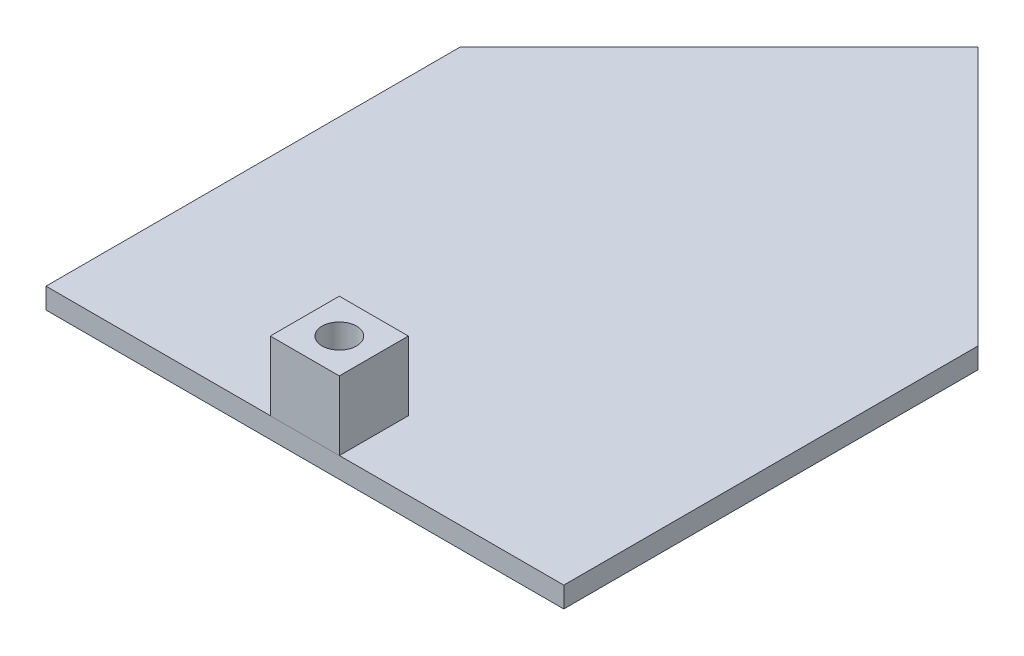
ISO-10303-21;
HEADER;
FILE_DESCRIPTION(('STEP AP214'),'2;1');
FILE_NAME('part.step','',(''),(''),'','','');
FILE_SCHEMA(('AUTOMOTIVE_DESIGN { 1 0 10303 214 1 1 1 1 }'));
ENDSEC;
DATA;
#1=APPLICATION_CONTEXT('core data for automotive mechanical design processes');
#2=APPLICATION_PROTOCOL_DEFINITION('international standard','automotive_design',2000,#1);
#3=PRODUCT_CONTEXT('',#1,'mechanical');
#4=PRODUCT('Part','Part','',(#3));
#5=PRODUCT_RELATED_PRODUCT_CATEGORY('part','',(#4));
#6=PRODUCT_DEFINITION_FORMATION('','',#4);
#7=PRODUCT_DEFINITION_CONTEXT('part definition',#1,'design');
#8=PRODUCT_DEFINITION('design','',#6,#7);
#9=PRODUCT_DEFINITION_SHAPE('','',#8);
#10=(LENGTH_UNIT() NAMED_UNIT(*) SI_UNIT(.MILLI.,.METRE.));
#11=(NAMED_UNIT(*) PLANE_ANGLE_UNIT() SI_UNIT($,.RADIAN.));
#12=(NAMED_UNIT(*) SI_UNIT($,.STERADIAN.) SOLID_ANGLE_UNIT());
#13=UNCERTAINTY_MEASURE_WITH_UNIT(LENGTH_MEASURE(1.E-05),#10,'distance_accuracy_value','');
#14=(GEOMETRIC_REPRESENTATION_CONTEXT(3) GLOBAL_UNCERTAINTY_ASSIGNED_CONTEXT((#13)) GLOBAL_UNIT_ASSIGNED_CONTEXT((#10,
#11,#12)) REPRESENTATION_CONTEXT('',''));
#15=CARTESIAN_POINT('',(0.,0.,0.));
#16=DIRECTION('',(0.,0.,1.));
#17=DIRECTION('',(1.,0.,0.));
#18=AXIS2_PLACEMENT_3D('',#15,#16,#17);
#19=CARTESIAN_POINT('',(-34.0392770239018,6.,-85.8256464799716));
#20=DIRECTION('',(1.,0.,0.));
#21=DIRECTION('',(0.,0.,-1.));
#22=AXIS2_PLACEMENT_3D('',#19,#20,#21);
#23=PLANE('',#22);
#24=DIRECTION('',(0.,0.,1.));
#25=VECTOR('',#24,1.);
#26=CARTESIAN_POINT('',(-34.0392770239018,0.,-85.8256464799716));
#27=LINE('',#26,#25);
#28=CARTESIAN_POINT('',(-34.0392770239018,0.,-85.8256464799716));
#29=VERTEX_POINT('',#28);
#30=CARTESIAN_POINT('',(-34.0392770239018,0.,34.1743535200284));
#31=VERTEX_POINT('',#30);
#32=EDGE_CURVE('E133',#29,#31,#27,.T.);
#33=ORIENTED_EDGE('',*,*,#32,.T.);
#34=DIRECTION('',(0.,-1.,0.));
#35=VECTOR('',#34,1.);
#36=CARTESIAN_POINT('',(-34.0392770239018,6.,34.1743535200284));
#37=LINE('',#36,#35);
#38=CARTESIAN_POINT('',(-34.0392770239018,6.,34.1743535200284));
#39=VERTEX_POINT('',#38);
#40=EDGE_CURVE('E38',#39,#31,#37,.T.);
#41=ORIENTED_EDGE('',*,*,#40,.F.);
#42=DIRECTION('',(0.,0.,1.));
#43=VECTOR('',#42,1.);
#44=CARTESIAN_POINT('',(-34.0392770239018,6.,-85.8256464799716));
#45=LINE('',#44,#43);
#46=CARTESIAN_POINT('',(-34.0392770239018,6.,-85.8256464799716));
#47=VERTEX_POINT('',#46);
#48=EDGE_CURVE('E142',#47,#39,#45,.T.);
#49=ORIENTED_EDGE('',*,*,#48,.F.);
#50=DIRECTION('',(0.,-1.,0.));
#51=VECTOR('',#50,1.);
#52=CARTESIAN_POINT('',(-34.0392770239018,6.,-85.8256464799716));
#53=LINE('',#52,#51);
#54=EDGE_CURVE('E156',#47,#29,#53,.T.);
#55=ORIENTED_EDGE('',*,*,#54,.T.);
#56=EDGE_LOOP('',(#33,#41,#49,#55));
#57=FACE_BOUND('',#56,.T.);
#58=ADVANCED_FACE('F35',(#57),#23,.F.);
#59=CARTESIAN_POINT('',(-34.0392770239018,6.,34.1743535200284));
#60=DIRECTION('',(0.,0.,-1.));
#61=DIRECTION('',(-1.,0.,0.));
#62=AXIS2_PLACEMENT_3D('',#59,#60,#61);
#63=PLANE('',#62);
#64=DIRECTION('',(1.,0.,0.));
#65=VECTOR('',#64,1.);
#66=CARTESIAN_POINT('',(-34.0392770239018,0.,34.1743535200284));
#67=LINE('',#66,#65);
#68=CARTESIAN_POINT('',(115.960722976098,0.,34.1743535200284));
#69=VERTEX_POINT('',#68);
#70=EDGE_CURVE('E136',#31,#69,#67,.T.);
#71=ORIENTED_EDGE('',*,*,#70,.T.);
#72=DIRECTION('',(0.,-1.,0.));
#73=VECTOR('',#72,1.);
#74=CARTESIAN_POINT('',(115.960722976098,6.,34.1743535200284));
#75=LINE('',#74,#73);
#76=CARTESIAN_POINT('',(115.960722976098,6.,34.1743535200284));
#77=VERTEX_POINT('',#76);
#78=EDGE_CURVE('E171',#77,#69,#75,.T.);
#79=ORIENTED_EDGE('',*,*,#78,.F.);
#80=DIRECTION('',(1.,0.,0.));
#81=VECTOR('',#80,1.);
#82=CARTESIAN_POINT('',(-34.0392770239018,6.,34.1743535200284));
#83=LINE('',#82,#81);
#84=CARTESIAN_POINT('',(50.9607229760982,6.,34.1743535200284));
#85=VERTEX_POINT('',#84);
#86=EDGE_CURVE('E145',#85,#77,#83,.T.);
#87=ORIENTED_EDGE('',*,*,#86,.F.);
#88=CARTESIAN_POINT('',(30.9607229760982,6.,34.1743535200284));
#89=VERTEX_POINT('',#88);
#90=EDGE_CURVE('E151',#89,#85,#83,.T.);
#91=ORIENTED_EDGE('',*,*,#90,.F.);
#92=EDGE_CURVE('E147',#39,#89,#83,.T.);
#93=ORIENTED_EDGE('',*,*,#92,.F.);
#94=ORIENTED_EDGE('',*,*,#40,.T.);
#95=EDGE_LOOP('',(#71,#79,#87,#91,#93,#94));
#96=FACE_BOUND('',#95,.T.);
#97=ADVANCED_FACE('F180',(#96),#63,.F.);
#98=CARTESIAN_POINT('',(115.960722976098,6.,34.1743535200284));
#99=DIRECTION('',(-1.,0.,0.));
#100=DIRECTION('',(0.,0.,1.));
#101=AXIS2_PLACEMENT_3D('',#98,#99,#100);
#102=PLANE('',#101);
#103=DIRECTION('',(0.,0.,-1.));
#104=VECTOR('',#103,1.);
#105=CARTESIAN_POINT('',(115.960722976098,0.,34.1743535200284));
#106=LINE('',#105,#104);
#107=CARTESIAN_POINT('',(115.960722976098,0.,-85.8256464799721));
#108=VERTEX_POINT('',#107);
#109=EDGE_CURVE('E159',#69,#108,#106,.T.);
#110=ORIENTED_EDGE('',*,*,#109,.T.);
#111=DIRECTION('',(0.,-1.,0.));
#112=VECTOR('',#111,1.);
#113=CARTESIAN_POINT('',(115.960722976098,6.,-85.8256464799721));
#114=LINE('',#113,#112);
#115=CARTESIAN_POINT('',(115.960722976098,6.,-85.8256464799721));
#116=VERTEX_POINT('',#115);
#117=EDGE_CURVE('E169',#116,#108,#114,.T.);
#118=ORIENTED_EDGE('',*,*,#117,.F.);
#119=DIRECTION('',(0.,0.,-1.));
#120=VECTOR('',#119,1.);
#121=CARTESIAN_POINT('',(115.960722976098,6.,34.1743535200284));
#122=LINE('',#121,#120);
#123=EDGE_CURVE('E150',#77,#116,#122,.T.);
#124=ORIENTED_EDGE('',*,*,#123,.F.);
#125=ORIENTED_EDGE('',*,*,#78,.T.);
#126=EDGE_LOOP('',(#110,#118,#124,#125));
#127=FACE_BOUND('',#126,.T.);
#128=ADVANCED_FACE('F190',(#127),#102,.F.);
#129=CARTESIAN_POINT('',(115.960722976098,6.,-85.8256464799721));
#130=DIRECTION('',(-0.707106781186546,0.,0.707106781186549));
#131=DIRECTION('',(0.707106781186549,0.,0.707106781186546));
#132=AXIS2_PLACEMENT_3D('',#129,#130,#131);
#133=PLANE('',#132);
#134=DIRECTION('',(-0.707106781186549,0.,-0.707106781186546));
#135=VECTOR('',#134,1.);
#136=CARTESIAN_POINT('',(115.960722976098,0.,-85.8256464799721));
#137=LINE('',#136,#135);
#138=CARTESIAN_POINT('',(40.9607229760982,0.,-160.825646479972));
#139=VERTEX_POINT('',#138);
#140=EDGE_CURVE('E161',#108,#139,#137,.T.);
#141=ORIENTED_EDGE('',*,*,#140,.T.);
#142=DIRECTION('',(0.,-1.,0.));
#143=VECTOR('',#142,1.);
#144=CARTESIAN_POINT('',(40.9607229760982,6.,-160.825646479972));
#145=LINE('',#144,#143);
#146=CARTESIAN_POINT('',(40.9607229760982,6.,-160.825646479972));
#147=VERTEX_POINT('',#146);
#148=EDGE_CURVE('E166',#147,#139,#145,.T.);
#149=ORIENTED_EDGE('',*,*,#148,.F.);
#150=DIRECTION('',(-0.707106781186549,0.,-0.707106781186546));
#151=VECTOR('',#150,1.);
#152=CARTESIAN_POINT('',(115.960722976098,6.,-85.8256464799721));
#153=LINE('',#152,#151);
#154=EDGE_CURVE('E153',#116,#147,#153,.T.);
#155=ORIENTED_EDGE('',*,*,#154,.F.);
#156=ORIENTED_EDGE('',*,*,#117,.T.);
#157=EDGE_LOOP('',(#141,#149,#155,#156));
#158=FACE_BOUND('',#157,.T.);
#159=ADVANCED_FACE('F193',(#158),#133,.F.);
#160=CARTESIAN_POINT('',(40.9607229760982,6.,-160.825646479972));
#161=DIRECTION('',(0.707106781186549,0.,0.707106781186546));
#162=DIRECTION('',(0.707106781186546,0.,-0.707106781186549));
#163=AXIS2_PLACEMENT_3D('',#160,#161,#162);
#164=PLANE('',#163);
#165=DIRECTION('',(-0.707106781186546,0.,0.707106781186549));
#166=VECTOR('',#165,1.);
#167=CARTESIAN_POINT('',(40.9607229760982,0.,-160.825646479972));
#168=LINE('',#167,#166);
#169=EDGE_CURVE('E146',#139,#29,#168,.T.);
#170=ORIENTED_EDGE('',*,*,#169,.T.);
#171=ORIENTED_EDGE('',*,*,#54,.F.);
#172=DIRECTION('',(-0.707106781186546,0.,0.707106781186549));
#173=VECTOR('',#172,1.);
#174=CARTESIAN_POINT('',(40.9607229760982,6.,-160.825646479972));
#175=LINE('',#174,#173);
#176=EDGE_CURVE('E155',#147,#47,#175,.T.);
#177=ORIENTED_EDGE('',*,*,#176,.F.);
#178=ORIENTED_EDGE('',*,*,#148,.T.);
#179=EDGE_LOOP('',(#170,#171,#177,#178));
#180=FACE_BOUND('',#179,.T.);
#181=ADVANCED_FACE('F251',(#180),#164,.F.);
#182=CARTESIAN_POINT('',(0.,6.,0.));
#183=DIRECTION('',(0.,1.,0.));
#184=DIRECTION('',(0.,0.,1.));
#185=AXIS2_PLACEMENT_3D('',#182,#183,#184);
#186=PLANE('',#185);
#187=DIRECTION('',(0.,0.,-1.));
#188=VECTOR('',#187,1.);
#189=CARTESIAN_POINT('',(50.9607229760982,6.,14.2063659947711));
#190=LINE('',#189,#188);
#191=CARTESIAN_POINT('',(50.9607229760982,6.,14.2063659947711));
#192=VERTEX_POINT('',#191);
#193=EDGE_CURVE('E11',#85,#192,#190,.T.);
#194=ORIENTED_EDGE('',*,*,#193,.F.);
#195=ORIENTED_EDGE('',*,*,#86,.T.);
#196=ORIENTED_EDGE('',*,*,#123,.T.);
#197=ORIENTED_EDGE('',*,*,#154,.T.);
#198=ORIENTED_EDGE('',*,*,#176,.T.);
#199=ORIENTED_EDGE('',*,*,#48,.T.);
#200=ORIENTED_EDGE('',*,*,#92,.T.);
#201=DIRECTION('',(0.,0.,1.));
#202=VECTOR('',#201,1.);
#203=CARTESIAN_POINT('',(30.9607229760982,6.,14.2063659947711));
#204=LINE('',#203,#202);
#205=CARTESIAN_POINT('',(30.9607229760982,6.,14.2063659947711));
#206=VERTEX_POINT('',#205);
#207=EDGE_CURVE('E214',#206,#89,#204,.T.);
#208=ORIENTED_EDGE('',*,*,#207,.F.);
#209=DIRECTION('',(-1.,0.,0.));
#210=VECTOR('',#209,1.);
#211=CARTESIAN_POINT('',(30.9607229760982,6.,14.2063659947711));
#212=LINE('',#211,#210);
#213=EDGE_CURVE('E51',#192,#206,#212,.T.);
#214=ORIENTED_EDGE('',*,*,#213,.F.);
#215=EDGE_LOOP('',(#194,#195,#196,#197,#198,#199,#200,#208,#214));
#216=FACE_BOUND('',#215,.T.);
#217=ADVANCED_FACE('F196',(#216),#186,.T.);
#218=CARTESIAN_POINT('',(0.,0.,0.));
#219=DIRECTION('',(0.,1.,0.));
#220=DIRECTION('',(0.,0.,1.));
#221=AXIS2_PLACEMENT_3D('',#218,#219,#220);
#222=PLANE('',#221);
#223=ORIENTED_EDGE('',*,*,#32,.F.);
#224=ORIENTED_EDGE('',*,*,#169,.F.);
#225=ORIENTED_EDGE('',*,*,#140,.F.);
#226=ORIENTED_EDGE('',*,*,#109,.F.);
#227=ORIENTED_EDGE('',*,*,#70,.F.);
#228=EDGE_LOOP('',(#223,#224,#225,#226,#227));
#229=FACE_BOUND('',#228,.T.);
#230=ADVANCED_FACE('F187',(#229),#222,.F.);
#231=CARTESIAN_POINT('',(0.,26.,0.));
#232=DIRECTION('',(0.,-1.,0.));
#233=DIRECTION('',(0.,0.,-1.));
#234=AXIS2_PLACEMENT_3D('',#231,#232,#233);
#235=PLANE('',#234);
#236=DIRECTION('',(0.,0.,-1.));
#237=VECTOR('',#236,1.);
#238=CARTESIAN_POINT('',(50.9607229760982,26.,14.2063659947711));
#239=LINE('',#238,#237);
#240=CARTESIAN_POINT('',(50.9607229760982,26.,34.2063659947711));
#241=VERTEX_POINT('',#240);
#242=CARTESIAN_POINT('',(50.9607229760982,26.,14.2063659947711));
#243=VERTEX_POINT('',#242);
#244=EDGE_CURVE('E119',#241,#243,#239,.T.);
#245=ORIENTED_EDGE('',*,*,#244,.T.);
#246=DIRECTION('',(-1.,0.,0.));
#247=VECTOR('',#246,1.);
#248=CARTESIAN_POINT('',(30.9607229760982,26.,14.2063659947711));
#249=LINE('',#248,#247);
#250=CARTESIAN_POINT('',(30.9607229760982,26.,14.2063659947711));
#251=VERTEX_POINT('',#250);
#252=EDGE_CURVE('E109',#243,#251,#249,.T.);
#253=ORIENTED_EDGE('',*,*,#252,.T.);
#254=DIRECTION('',(0.,0.,1.));
#255=VECTOR('',#254,1.);
#256=CARTESIAN_POINT('',(30.9607229760982,26.,14.2063659947711));
#257=LINE('',#256,#255);
#258=CARTESIAN_POINT('',(30.9607229760982,26.,34.2063659947711));
#259=VERTEX_POINT('',#258);
#260=EDGE_CURVE('E118',#251,#259,#257,.T.);
#261=ORIENTED_EDGE('',*,*,#260,.T.);
#262=DIRECTION('',(1.,0.,0.));
#263=VECTOR('',#262,1.);
#264=CARTESIAN_POINT('',(50.9607229760982,26.,34.2063659947711));
#265=LINE('',#264,#263);
#266=EDGE_CURVE('E125',#259,#241,#265,.T.);
#267=ORIENTED_EDGE('',*,*,#266,.T.);
#268=EDGE_LOOP('',(#245,#253,#261,#267));
#269=FACE_BOUND('',#268,.T.);
#270=CARTESIAN_POINT('',(40.9607229760982,26.,24.2063659947711));
#271=DIRECTION('',(0.,1.,0.));
#272=DIRECTION('',(0.,0.,1.));
#273=AXIS2_PLACEMENT_3D('',#270,#271,#272);
#274=CIRCLE('',#273,5.);
#275=CARTESIAN_POINT('',(40.9607229760982,26.,29.2063659947711));
#276=VERTEX_POINT('',#275);
#277=EDGE_CURVE('E206',#276,#276,#274,.T.);
#278=ORIENTED_EDGE('',*,*,#277,.F.);
#279=EDGE_LOOP('',(#278));
#280=FACE_BOUND('',#279,.T.);
#281=ADVANCED_FACE('F122',(#269,#280),#235,.F.);
#282=CARTESIAN_POINT('',(0.,6.,0.));
#283=DIRECTION('',(0.,-1.,0.));
#284=DIRECTION('',(0.,0.,-1.));
#285=AXIS2_PLACEMENT_3D('',#282,#283,#284);
#286=PLANE('',#285);
#287=CARTESIAN_POINT('',(30.9607229760982,6.,34.2063659947711));
#288=VERTEX_POINT('',#287);
#289=EDGE_CURVE('E203',#89,#288,#204,.T.);
#290=ORIENTED_EDGE('',*,*,#289,.F.);
#291=ORIENTED_EDGE('',*,*,#90,.T.);
#292=CARTESIAN_POINT('',(50.9607229760982,6.,34.2063659947711));
#293=VERTEX_POINT('',#292);
#294=EDGE_CURVE('E44',#293,#85,#190,.T.);
#295=ORIENTED_EDGE('',*,*,#294,.F.);
#296=DIRECTION('',(1.,0.,0.));
#297=VECTOR('',#296,1.);
#298=CARTESIAN_POINT('',(50.9607229760982,6.,34.2063659947711));
#299=LINE('',#298,#297);
#300=EDGE_CURVE('E129',#288,#293,#299,.T.);
#301=ORIENTED_EDGE('',*,*,#300,.F.);
#302=EDGE_LOOP('',(#290,#291,#295,#301));
#303=FACE_BOUND('',#302,.T.);
#304=ADVANCED_FACE('F201',(#303),#286,.T.);
#305=CARTESIAN_POINT('',(50.9607229760982,26.,14.2063659947711));
#306=DIRECTION('',(-1.,0.,0.));
#307=DIRECTION('',(0.,0.,1.));
#308=AXIS2_PLACEMENT_3D('',#305,#306,#307);
#309=PLANE('',#308);
#310=ORIENTED_EDGE('',*,*,#294,.T.);
#311=ORIENTED_EDGE('',*,*,#193,.T.);
#312=DIRECTION('',(0.,-1.,0.));
#313=VECTOR('',#312,1.);
#314=CARTESIAN_POINT('',(50.9607229760982,26.,14.2063659947711));
#315=LINE('',#314,#313);
#316=EDGE_CURVE('E113',#243,#192,#315,.T.);
#317=ORIENTED_EDGE('',*,*,#316,.F.);
#318=ORIENTED_EDGE('',*,*,#244,.F.);
#319=DIRECTION('',(0.,-1.,0.));
#320=VECTOR('',#319,1.);
#321=CARTESIAN_POINT('',(50.9607229760982,26.,34.2063659947711));
#322=LINE('',#321,#320);
#323=EDGE_CURVE('E205',#241,#293,#322,.T.);
#324=ORIENTED_EDGE('',*,*,#323,.T.);
#325=EDGE_LOOP('',(#310,#311,#317,#318,#324));
#326=FACE_BOUND('',#325,.T.);
#327=ADVANCED_FACE('F132',(#326),#309,.F.);
#328=CARTESIAN_POINT('',(30.9607229760982,26.,14.2063659947711));
#329=DIRECTION('',(0.,0.,1.));
#330=DIRECTION('',(1.,0.,0.));
#331=AXIS2_PLACEMENT_3D('',#328,#329,#330);
#332=PLANE('',#331);
#333=ORIENTED_EDGE('',*,*,#213,.T.);
#334=DIRECTION('',(0.,-1.,0.));
#335=VECTOR('',#334,1.);
#336=CARTESIAN_POINT('',(30.9607229760982,26.,14.2063659947711));
#337=LINE('',#336,#335);
#338=EDGE_CURVE('E115',#251,#206,#337,.T.);
#339=ORIENTED_EDGE('',*,*,#338,.F.);
#340=ORIENTED_EDGE('',*,*,#252,.F.);
#341=ORIENTED_EDGE('',*,*,#316,.T.);
#342=EDGE_LOOP('',(#333,#339,#340,#341));
#343=FACE_BOUND('',#342,.T.);
#344=ADVANCED_FACE('F111',(#343),#332,.F.);
#345=CARTESIAN_POINT('',(30.9607229760982,26.,14.2063659947711));
#346=DIRECTION('',(1.,0.,0.));
#347=DIRECTION('',(0.,0.,-1.));
#348=AXIS2_PLACEMENT_3D('',#345,#346,#347);
#349=PLANE('',#348);
#350=ORIENTED_EDGE('',*,*,#207,.T.);
#351=ORIENTED_EDGE('',*,*,#289,.T.);
#352=DIRECTION('',(0.,-1.,0.));
#353=VECTOR('',#352,1.);
#354=CARTESIAN_POINT('',(30.9607229760982,26.,34.2063659947711));
#355=LINE('',#354,#353);
#356=EDGE_CURVE('E138',#259,#288,#355,.T.);
#357=ORIENTED_EDGE('',*,*,#356,.F.);
#358=ORIENTED_EDGE('',*,*,#260,.F.);
#359=ORIENTED_EDGE('',*,*,#338,.T.);
#360=EDGE_LOOP('',(#350,#351,#357,#358,#359));
#361=FACE_BOUND('',#360,.T.);
#362=ADVANCED_FACE('F222',(#361),#349,.F.);
#363=CARTESIAN_POINT('',(50.9607229760982,26.,34.2063659947711));
#364=DIRECTION('',(0.,0.,-1.));
#365=DIRECTION('',(-1.,0.,0.));
#366=AXIS2_PLACEMENT_3D('',#363,#364,#365);
#367=PLANE('',#366);
#368=ORIENTED_EDGE('',*,*,#300,.T.);
#369=ORIENTED_EDGE('',*,*,#323,.F.);
#370=ORIENTED_EDGE('',*,*,#266,.F.);
#371=ORIENTED_EDGE('',*,*,#356,.T.);
#372=EDGE_LOOP('',(#368,#369,#370,#371));
#373=FACE_BOUND('',#372,.T.);
#374=ADVANCED_FACE('F220',(#373),#367,.F.);
#375=CARTESIAN_POINT('',(40.9607229760982,26.,24.2063659947711));
#376=DIRECTION('',(0.,-1.,0.));
#377=DIRECTION('',(0.,0.,-1.));
#378=AXIS2_PLACEMENT_3D('',#375,#376,#377);
#379=CYLINDRICAL_SURFACE('',#378,5.);
#380=ORIENTED_EDGE('',*,*,#277,.T.);
#381=EDGE_LOOP('',(#380));
#382=FACE_BOUND('',#381,.T.);
#383=CARTESIAN_POINT('',(40.9607229760982,6.,24.2063659947711));
#384=DIRECTION('',(0.,1.,0.));
#385=DIRECTION('',(0.,0.,1.));
#386=AXIS2_PLACEMENT_3D('',#383,#384,#385);
#387=CIRCLE('',#386,5.);
#388=CARTESIAN_POINT('',(40.9607229760982,6.,29.2063659947711));
#389=VERTEX_POINT('',#388);
#390=EDGE_CURVE('E209',#389,#389,#387,.T.);
#391=ORIENTED_EDGE('',*,*,#390,.F.);
#392=EDGE_LOOP('',(#391));
#393=FACE_BOUND('',#392,.T.);
#394=ADVANCED_FACE('F229',(#382,#393),#379,.F.);
#395=ORIENTED_EDGE('',*,*,#390,.T.);
#396=EDGE_LOOP('',(#395));
#397=FACE_BOUND('',#396,.T.);
#398=ADVANCED_FACE('F227',(#397),#186,.T.);
#399=CLOSED_SHELL('',(#58,#97,#128,#159,#181,#217,#230,#281,#304,#327,#344,#362,#374,#394,#398));
#400=MANIFOLD_SOLID_BREP('B2',#399);
#401=ADVANCED_BREP_SHAPE_REPRESENTATION('',(#18,#400),#14);
#402=SHAPE_DEFINITION_REPRESENTATION(#9,#401);
ENDSEC;
END-ISO-10303-21;
